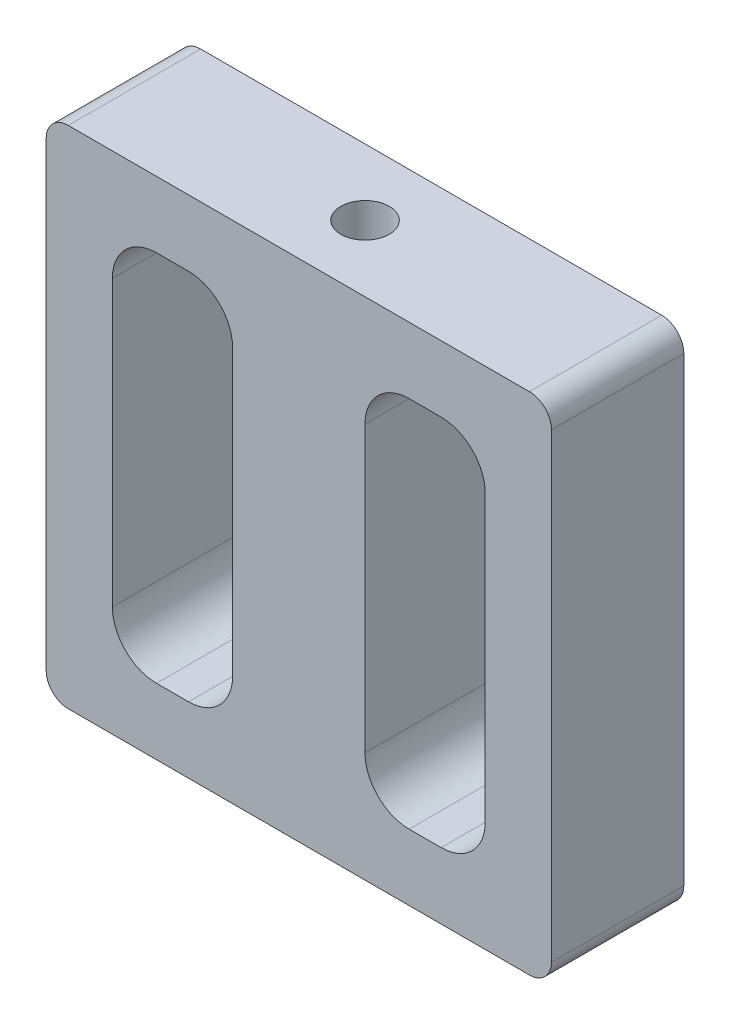
ISO-10303-21;
HEADER;
FILE_DESCRIPTION(('STEP AP214'),'2;1');
FILE_NAME('part.step','',(''),(''),'','','');
FILE_SCHEMA(('AUTOMOTIVE_DESIGN { 1 0 10303 214 1 1 1 1 }'));
ENDSEC;
DATA;
#1=APPLICATION_CONTEXT('core data for automotive mechanical design processes');
#2=APPLICATION_PROTOCOL_DEFINITION('international standard','automotive_design',2000,#1);
#3=PRODUCT_CONTEXT('',#1,'mechanical');
#4=PRODUCT('Part','Part','',(#3));
#5=PRODUCT_RELATED_PRODUCT_CATEGORY('part','',(#4));
#6=PRODUCT_DEFINITION_FORMATION('','',#4);
#7=PRODUCT_DEFINITION_CONTEXT('part definition',#1,'design');
#8=PRODUCT_DEFINITION('design','',#6,#7);
#9=PRODUCT_DEFINITION_SHAPE('','',#8);
#10=(LENGTH_UNIT() NAMED_UNIT(*) SI_UNIT(.MILLI.,.METRE.));
#11=(NAMED_UNIT(*) PLANE_ANGLE_UNIT() SI_UNIT($,.RADIAN.));
#12=(NAMED_UNIT(*) SI_UNIT($,.STERADIAN.) SOLID_ANGLE_UNIT());
#13=UNCERTAINTY_MEASURE_WITH_UNIT(LENGTH_MEASURE(1.E-05),#10,'distance_accuracy_value','');
#14=(GEOMETRIC_REPRESENTATION_CONTEXT(3) GLOBAL_UNCERTAINTY_ASSIGNED_CONTEXT((#13)) GLOBAL_UNIT_ASSIGNED_CONTEXT((#10,
#11,#12)) REPRESENTATION_CONTEXT('',''));
#15=CARTESIAN_POINT('',(0.,0.,0.));
#16=DIRECTION('',(0.,0.,1.));
#17=DIRECTION('',(1.,0.,0.));
#18=AXIS2_PLACEMENT_3D('',#15,#16,#17);
#19=CARTESIAN_POINT('',(-11.45,-11.45,6.));
#20=DIRECTION('',(1.,0.,0.));
#21=DIRECTION('',(0.,0.,-1.));
#22=AXIS2_PLACEMENT_3D('',#19,#20,#21);
#23=PLANE('',#22);
#24=DIRECTION('',(0.,-1.,0.));
#25=VECTOR('',#24,1.);
#26=CARTESIAN_POINT('',(-11.45,-11.45,6.));
#27=LINE('',#26,#25);
#28=CARTESIAN_POINT('',(-11.45,10.45,6.));
#29=VERTEX_POINT('',#28);
#30=CARTESIAN_POINT('',(-11.45,-10.45,6.));
#31=VERTEX_POINT('',#30);
#32=EDGE_CURVE('E242',#29,#31,#27,.T.);
#33=ORIENTED_EDGE('',*,*,#32,.F.);
#34=DIRECTION('',(0.,0.,-1.));
#35=VECTOR('',#34,1.);
#36=CARTESIAN_POINT('',(-11.45,10.45,6.));
#37=LINE('',#36,#35);
#38=CARTESIAN_POINT('',(-11.45,10.45,0.));
#39=VERTEX_POINT('',#38);
#40=EDGE_CURVE('E325',#29,#39,#37,.T.);
#41=ORIENTED_EDGE('',*,*,#40,.T.);
#42=DIRECTION('',(0.,-1.,0.));
#43=VECTOR('',#42,1.);
#44=CARTESIAN_POINT('',(-11.45,-11.45,0.));
#45=LINE('',#44,#43);
#46=CARTESIAN_POINT('',(-11.45,-10.45,0.));
#47=VERTEX_POINT('',#46);
#48=EDGE_CURVE('E237',#39,#47,#45,.T.);
#49=ORIENTED_EDGE('',*,*,#48,.T.);
#50=DIRECTION('',(0.,0.,-1.));
#51=VECTOR('',#50,1.);
#52=CARTESIAN_POINT('',(-11.45,-10.45,6.));
#53=LINE('',#52,#51);
#54=EDGE_CURVE('E323',#47,#31,#53,.F.);
#55=ORIENTED_EDGE('',*,*,#54,.T.);
#56=EDGE_LOOP('',(#33,#41,#49,#55));
#57=FACE_BOUND('',#56,.T.);
#58=ADVANCED_FACE('F34',(#57),#23,.F.);
#59=CARTESIAN_POINT('',(11.45,-11.45,6.));
#60=DIRECTION('',(0.,1.,0.));
#61=DIRECTION('',(-1.,0.,0.));
#62=AXIS2_PLACEMENT_3D('',#59,#60,#61);
#63=PLANE('',#62);
#64=CARTESIAN_POINT('',(0.,-11.45,3.));
#65=DIRECTION('',(0.,1.,0.));
#66=DIRECTION('',(-1.,0.,0.));
#67=AXIS2_PLACEMENT_3D('',#64,#65,#66);
#68=CIRCLE('',#67,1.1);
#69=CARTESIAN_POINT('',(-1.1,-11.45,3.));
#70=VERTEX_POINT('',#69);
#71=EDGE_CURVE('E234',#70,#70,#68,.T.);
#72=ORIENTED_EDGE('',*,*,#71,.T.);
#73=EDGE_LOOP('',(#72));
#74=FACE_BOUND('',#73,.T.);
#75=DIRECTION('',(1.,0.,0.));
#76=VECTOR('',#75,1.);
#77=CARTESIAN_POINT('',(11.45,-11.45,0.));
#78=LINE('',#77,#76);
#79=CARTESIAN_POINT('',(-10.45,-11.45,0.));
#80=VERTEX_POINT('',#79);
#81=CARTESIAN_POINT('',(10.45,-11.45,0.));
#82=VERTEX_POINT('',#81);
#83=EDGE_CURVE('E255',#80,#82,#78,.T.);
#84=ORIENTED_EDGE('',*,*,#83,.T.);
#85=DIRECTION('',(0.,0.,-1.));
#86=VECTOR('',#85,1.);
#87=CARTESIAN_POINT('',(10.45,-11.45,6.));
#88=LINE('',#87,#86);
#89=CARTESIAN_POINT('',(10.45,-11.45,6.));
#90=VERTEX_POINT('',#89);
#91=EDGE_CURVE('E11',#82,#90,#88,.F.);
#92=ORIENTED_EDGE('',*,*,#91,.T.);
#93=DIRECTION('',(1.,0.,0.));
#94=VECTOR('',#93,1.);
#95=CARTESIAN_POINT('',(11.45,-11.45,6.));
#96=LINE('',#95,#94);
#97=CARTESIAN_POINT('',(-10.45,-11.45,6.));
#98=VERTEX_POINT('',#97);
#99=EDGE_CURVE('E245',#98,#90,#96,.T.);
#100=ORIENTED_EDGE('',*,*,#99,.F.);
#101=DIRECTION('',(0.,0.,-1.));
#102=VECTOR('',#101,1.);
#103=CARTESIAN_POINT('',(-10.45,-11.45,6.));
#104=LINE('',#103,#102);
#105=EDGE_CURVE('E42',#98,#80,#104,.T.);
#106=ORIENTED_EDGE('',*,*,#105,.T.);
#107=EDGE_LOOP('',(#84,#92,#100,#106));
#108=FACE_BOUND('',#107,.T.);
#109=ADVANCED_FACE('F356',(#74,#108),#63,.F.);
#110=CARTESIAN_POINT('',(11.45,-11.45,6.));
#111=DIRECTION('',(-1.,0.,0.));
#112=DIRECTION('',(0.,0.,1.));
#113=AXIS2_PLACEMENT_3D('',#110,#111,#112);
#114=PLANE('',#113);
#115=DIRECTION('',(0.,1.,0.));
#116=VECTOR('',#115,1.);
#117=CARTESIAN_POINT('',(11.45,-11.45,0.));
#118=LINE('',#117,#116);
#119=CARTESIAN_POINT('',(11.45,-10.45,0.));
#120=VERTEX_POINT('',#119);
#121=CARTESIAN_POINT('',(11.45,10.45,0.));
#122=VERTEX_POINT('',#121);
#123=EDGE_CURVE('E258',#120,#122,#118,.T.);
#124=ORIENTED_EDGE('',*,*,#123,.T.);
#125=DIRECTION('',(0.,0.,-1.));
#126=VECTOR('',#125,1.);
#127=CARTESIAN_POINT('',(11.45,10.45,6.));
#128=LINE('',#127,#126);
#129=CARTESIAN_POINT('',(11.45,10.45,6.));
#130=VERTEX_POINT('',#129);
#131=EDGE_CURVE('E49',#122,#130,#128,.F.);
#132=ORIENTED_EDGE('',*,*,#131,.T.);
#133=DIRECTION('',(0.,1.,0.));
#134=VECTOR('',#133,1.);
#135=CARTESIAN_POINT('',(11.45,-11.45,6.));
#136=LINE('',#135,#134);
#137=CARTESIAN_POINT('',(11.45,-10.45,6.));
#138=VERTEX_POINT('',#137);
#139=EDGE_CURVE('E248',#138,#130,#136,.T.);
#140=ORIENTED_EDGE('',*,*,#139,.F.);
#141=DIRECTION('',(0.,0.,-1.));
#142=VECTOR('',#141,1.);
#143=CARTESIAN_POINT('',(11.45,-10.45,6.));
#144=LINE('',#143,#142);
#145=EDGE_CURVE('E348',#138,#120,#144,.T.);
#146=ORIENTED_EDGE('',*,*,#145,.T.);
#147=EDGE_LOOP('',(#124,#132,#140,#146));
#148=FACE_BOUND('',#147,.T.);
#149=ADVANCED_FACE('F365',(#148),#114,.F.);
#150=CARTESIAN_POINT('',(11.45,11.45,6.));
#151=DIRECTION('',(0.,-1.,0.));
#152=DIRECTION('',(1.,0.,0.));
#153=AXIS2_PLACEMENT_3D('',#150,#151,#152);
#154=PLANE('',#153);
#155=CARTESIAN_POINT('',(0.,11.45,3.));
#156=DIRECTION('',(0.,1.,0.));
#157=DIRECTION('',(-1.,0.,0.));
#158=AXIS2_PLACEMENT_3D('',#155,#156,#157);
#159=CIRCLE('',#158,1.1);
#160=CARTESIAN_POINT('',(-1.1,11.45,3.));
#161=VERTEX_POINT('',#160);
#162=EDGE_CURVE('E238',#161,#161,#159,.T.);
#163=ORIENTED_EDGE('',*,*,#162,.F.);
#164=EDGE_LOOP('',(#163));
#165=FACE_BOUND('',#164,.T.);
#166=DIRECTION('',(-1.,0.,0.));
#167=VECTOR('',#166,1.);
#168=CARTESIAN_POINT('',(11.45,11.45,0.));
#169=LINE('',#168,#167);
#170=CARTESIAN_POINT('',(10.45,11.45,0.));
#171=VERTEX_POINT('',#170);
#172=CARTESIAN_POINT('',(-10.45,11.45,0.));
#173=VERTEX_POINT('',#172);
#174=EDGE_CURVE('E246',#171,#173,#169,.T.);
#175=ORIENTED_EDGE('',*,*,#174,.T.);
#176=DIRECTION('',(0.,0.,-1.));
#177=VECTOR('',#176,1.);
#178=CARTESIAN_POINT('',(-10.45,11.45,6.));
#179=LINE('',#178,#177);
#180=CARTESIAN_POINT('',(-10.45,11.45,6.));
#181=VERTEX_POINT('',#180);
#182=EDGE_CURVE('E339',#173,#181,#179,.F.);
#183=ORIENTED_EDGE('',*,*,#182,.T.);
#184=DIRECTION('',(-1.,0.,0.));
#185=VECTOR('',#184,1.);
#186=CARTESIAN_POINT('',(11.45,11.45,6.));
#187=LINE('',#186,#185);
#188=CARTESIAN_POINT('',(10.45,11.45,6.));
#189=VERTEX_POINT('',#188);
#190=EDGE_CURVE('E250',#189,#181,#187,.T.);
#191=ORIENTED_EDGE('',*,*,#190,.F.);
#192=DIRECTION('',(0.,0.,-1.));
#193=VECTOR('',#192,1.);
#194=CARTESIAN_POINT('',(10.45,11.45,6.));
#195=LINE('',#194,#193);
#196=EDGE_CURVE('E336',#189,#171,#195,.T.);
#197=ORIENTED_EDGE('',*,*,#196,.T.);
#198=EDGE_LOOP('',(#175,#183,#191,#197));
#199=FACE_BOUND('',#198,.T.);
#200=ADVANCED_FACE('F374',(#165,#199),#154,.F.);
#201=CARTESIAN_POINT('',(0.,0.,6.));
#202=DIRECTION('',(0.,0.,1.));
#203=DIRECTION('',(1.,0.,0.));
#204=AXIS2_PLACEMENT_3D('',#201,#202,#203);
#205=PLANE('',#204);
#206=DIRECTION('',(-1.,0.,0.));
#207=VECTOR('',#206,1.);
#208=CARTESIAN_POINT('',(-3.,-8.45,6.));
#209=LINE('',#208,#207);
#210=CARTESIAN_POINT('',(-5.,-8.45,6.));
#211=VERTEX_POINT('',#210);
#212=CARTESIAN_POINT('',(-6.45,-8.45,6.));
#213=VERTEX_POINT('',#212);
#214=EDGE_CURVE('E241',#211,#213,#209,.T.);
#215=ORIENTED_EDGE('',*,*,#214,.T.);
#216=CARTESIAN_POINT('',(-6.45,-6.45,6.));
#217=DIRECTION('',(0.,0.,1.));
#218=DIRECTION('',(1.,0.,0.));
#219=AXIS2_PLACEMENT_3D('',#216,#217,#218);
#220=CIRCLE('',#219,2.);
#221=CARTESIAN_POINT('',(-8.45,-6.45,6.));
#222=VERTEX_POINT('',#221);
#223=EDGE_CURVE('E321',#213,#222,#220,.F.);
#224=ORIENTED_EDGE('',*,*,#223,.T.);
#225=DIRECTION('',(0.,1.,0.));
#226=VECTOR('',#225,1.);
#227=CARTESIAN_POINT('',(-8.45,8.45,6.));
#228=LINE('',#227,#226);
#229=CARTESIAN_POINT('',(-8.45,6.45,6.));
#230=VERTEX_POINT('',#229);
#231=EDGE_CURVE('E661',#222,#230,#228,.T.);
#232=ORIENTED_EDGE('',*,*,#231,.T.);
#233=CARTESIAN_POINT('',(-6.45,6.45,6.));
#234=DIRECTION('',(0.,0.,1.));
#235=DIRECTION('',(1.,0.,0.));
#236=AXIS2_PLACEMENT_3D('',#233,#234,#235);
#237=CIRCLE('',#236,2.);
#238=CARTESIAN_POINT('',(-6.44999999999999,8.45,6.));
#239=VERTEX_POINT('',#238);
#240=EDGE_CURVE('E313',#230,#239,#237,.F.);
#241=ORIENTED_EDGE('',*,*,#240,.T.);
#242=DIRECTION('',(1.,0.,0.));
#243=VECTOR('',#242,1.);
#244=CARTESIAN_POINT('',(-3.,8.45,6.));
#245=LINE('',#244,#243);
#246=CARTESIAN_POINT('',(-5.,8.45,6.));
#247=VERTEX_POINT('',#246);
#248=EDGE_CURVE('E674',#239,#247,#245,.T.);
#249=ORIENTED_EDGE('',*,*,#248,.T.);
#250=CARTESIAN_POINT('',(-5.,6.45,6.));
#251=DIRECTION('',(0.,0.,1.));
#252=DIRECTION('',(1.,0.,0.));
#253=AXIS2_PLACEMENT_3D('',#250,#251,#252);
#254=CIRCLE('',#253,2.);
#255=CARTESIAN_POINT('',(-3.,6.45,6.));
#256=VERTEX_POINT('',#255);
#257=EDGE_CURVE('E309',#247,#256,#254,.F.);
#258=ORIENTED_EDGE('',*,*,#257,.T.);
#259=DIRECTION('',(0.,-1.,0.));
#260=VECTOR('',#259,1.);
#261=CARTESIAN_POINT('',(-3.,8.45,6.));
#262=LINE('',#261,#260);
#263=CARTESIAN_POINT('',(-3.,-6.45,6.));
#264=VERTEX_POINT('',#263);
#265=EDGE_CURVE('E671',#256,#264,#262,.T.);
#266=ORIENTED_EDGE('',*,*,#265,.T.);
#267=CARTESIAN_POINT('',(-5.,-6.45,6.));
#268=DIRECTION('',(0.,0.,1.));
#269=DIRECTION('',(1.,0.,0.));
#270=AXIS2_PLACEMENT_3D('',#267,#268,#269);
#271=CIRCLE('',#270,2.);
#272=EDGE_CURVE('E317',#264,#211,#271,.F.);
#273=ORIENTED_EDGE('',*,*,#272,.T.);
#274=EDGE_LOOP('',(#215,#224,#232,#241,#249,#258,#266,#273));
#275=FACE_BOUND('',#274,.T.);
#276=DIRECTION('',(-1.,0.,0.));
#277=VECTOR('',#276,1.);
#278=CARTESIAN_POINT('',(3.,-8.45,6.));
#279=LINE('',#278,#277);
#280=CARTESIAN_POINT('',(6.45,-8.45,6.));
#281=VERTEX_POINT('',#280);
#282=CARTESIAN_POINT('',(5.,-8.45,6.));
#283=VERTEX_POINT('',#282);
#284=EDGE_CURVE('E639',#281,#283,#279,.T.);
#285=ORIENTED_EDGE('',*,*,#284,.T.);
#286=CARTESIAN_POINT('',(5.,-6.45,6.));
#287=DIRECTION('',(0.,0.,1.));
#288=DIRECTION('',(1.,0.,0.));
#289=AXIS2_PLACEMENT_3D('',#286,#287,#288);
#290=CIRCLE('',#289,2.);
#291=CARTESIAN_POINT('',(3.,-6.45,6.));
#292=VERTEX_POINT('',#291);
#293=EDGE_CURVE('E301',#283,#292,#290,.F.);
#294=ORIENTED_EDGE('',*,*,#293,.T.);
#295=DIRECTION('',(0.,1.,0.));
#296=VECTOR('',#295,1.);
#297=CARTESIAN_POINT('',(3.,8.45,6.));
#298=LINE('',#297,#296);
#299=CARTESIAN_POINT('',(3.,6.45,6.));
#300=VERTEX_POINT('',#299);
#301=EDGE_CURVE('E228',#292,#300,#298,.T.);
#302=ORIENTED_EDGE('',*,*,#301,.T.);
#303=CARTESIAN_POINT('',(5.,6.45,6.));
#304=DIRECTION('',(0.,0.,1.));
#305=DIRECTION('',(1.,0.,0.));
#306=AXIS2_PLACEMENT_3D('',#303,#304,#305);
#307=CIRCLE('',#306,2.);
#308=CARTESIAN_POINT('',(5.,8.45,6.));
#309=VERTEX_POINT('',#308);
#310=EDGE_CURVE('E305',#300,#309,#307,.F.);
#311=ORIENTED_EDGE('',*,*,#310,.T.);
#312=DIRECTION('',(1.,0.,0.));
#313=VECTOR('',#312,1.);
#314=CARTESIAN_POINT('',(3.,8.45,6.));
#315=LINE('',#314,#313);
#316=CARTESIAN_POINT('',(6.45,8.45,6.));
#317=VERTEX_POINT('',#316);
#318=EDGE_CURVE('E654',#309,#317,#315,.T.);
#319=ORIENTED_EDGE('',*,*,#318,.T.);
#320=CARTESIAN_POINT('',(6.45,6.45,6.));
#321=DIRECTION('',(0.,0.,1.));
#322=DIRECTION('',(1.,0.,0.));
#323=AXIS2_PLACEMENT_3D('',#320,#321,#322);
#324=CIRCLE('',#323,2.);
#325=CARTESIAN_POINT('',(8.45,6.45,6.));
#326=VERTEX_POINT('',#325);
#327=EDGE_CURVE('E206',#317,#326,#324,.F.);
#328=ORIENTED_EDGE('',*,*,#327,.T.);
#329=DIRECTION('',(0.,-1.,0.));
#330=VECTOR('',#329,1.);
#331=CARTESIAN_POINT('',(8.45,8.45,6.));
#332=LINE('',#331,#330);
#333=CARTESIAN_POINT('',(8.45,-6.45,6.));
#334=VERTEX_POINT('',#333);
#335=EDGE_CURVE('E216',#326,#334,#332,.T.);
#336=ORIENTED_EDGE('',*,*,#335,.T.);
#337=CARTESIAN_POINT('',(6.45,-6.45,6.));
#338=DIRECTION('',(0.,0.,1.));
#339=DIRECTION('',(1.,0.,0.));
#340=AXIS2_PLACEMENT_3D('',#337,#338,#339);
#341=CIRCLE('',#340,2.);
#342=EDGE_CURVE('E297',#334,#281,#341,.F.);
#343=ORIENTED_EDGE('',*,*,#342,.T.);
#344=EDGE_LOOP('',(#285,#294,#302,#311,#319,#328,#336,#343));
#345=FACE_BOUND('',#344,.T.);
#346=ORIENTED_EDGE('',*,*,#190,.T.);
#347=CARTESIAN_POINT('',(-10.45,10.45,6.));
#348=DIRECTION('',(0.,0.,1.));
#349=DIRECTION('',(1.,0.,0.));
#350=AXIS2_PLACEMENT_3D('',#347,#348,#349);
#351=CIRCLE('',#350,1.);
#352=EDGE_CURVE('E346',#181,#29,#351,.T.);
#353=ORIENTED_EDGE('',*,*,#352,.T.);
#354=ORIENTED_EDGE('',*,*,#32,.T.);
#355=CARTESIAN_POINT('',(-10.45,-10.45,6.));
#356=DIRECTION('',(0.,0.,1.));
#357=DIRECTION('',(1.,0.,0.));
#358=AXIS2_PLACEMENT_3D('',#355,#356,#357);
#359=CIRCLE('',#358,1.);
#360=EDGE_CURVE('E341',#31,#98,#359,.T.);
#361=ORIENTED_EDGE('',*,*,#360,.T.);
#362=ORIENTED_EDGE('',*,*,#99,.T.);
#363=CARTESIAN_POINT('',(10.45,-10.45,6.));
#364=DIRECTION('',(0.,0.,1.));
#365=DIRECTION('',(1.,0.,0.));
#366=AXIS2_PLACEMENT_3D('',#363,#364,#365);
#367=CIRCLE('',#366,1.);
#368=EDGE_CURVE('E56',#90,#138,#367,.T.);
#369=ORIENTED_EDGE('',*,*,#368,.T.);
#370=ORIENTED_EDGE('',*,*,#139,.T.);
#371=CARTESIAN_POINT('',(10.45,10.45,6.));
#372=DIRECTION('',(0.,0.,1.));
#373=DIRECTION('',(1.,0.,0.));
#374=AXIS2_PLACEMENT_3D('',#371,#372,#373);
#375=CIRCLE('',#374,1.);
#376=EDGE_CURVE('E344',#130,#189,#375,.T.);
#377=ORIENTED_EDGE('',*,*,#376,.T.);
#378=EDGE_LOOP('',(#346,#353,#354,#361,#362,#369,#370,#377));
#379=FACE_BOUND('',#378,.T.);
#380=ADVANCED_FACE('F367',(#275,#345,#379),#205,.T.);
#381=CARTESIAN_POINT('',(0.,0.,0.));
#382=DIRECTION('',(0.,0.,1.));
#383=DIRECTION('',(1.,0.,0.));
#384=AXIS2_PLACEMENT_3D('',#381,#382,#383);
#385=PLANE('',#384);
#386=DIRECTION('',(1.,0.,0.));
#387=VECTOR('',#386,1.);
#388=CARTESIAN_POINT('',(-3.,8.45,0.));
#389=LINE('',#388,#387);
#390=CARTESIAN_POINT('',(-6.44999999999999,8.45,0.));
#391=VERTEX_POINT('',#390);
#392=CARTESIAN_POINT('',(-5.,8.45,0.));
#393=VERTEX_POINT('',#392);
#394=EDGE_CURVE('E665',#391,#393,#389,.T.);
#395=ORIENTED_EDGE('',*,*,#394,.F.);
#396=CARTESIAN_POINT('',(-6.45,6.45,0.));
#397=DIRECTION('',(0.,0.,1.));
#398=DIRECTION('',(1.,0.,0.));
#399=AXIS2_PLACEMENT_3D('',#396,#397,#398);
#400=CIRCLE('',#399,2.);
#401=CARTESIAN_POINT('',(-8.45,6.45,0.));
#402=VERTEX_POINT('',#401);
#403=EDGE_CURVE('E311',#391,#402,#400,.T.);
#404=ORIENTED_EDGE('',*,*,#403,.T.);
#405=DIRECTION('',(0.,1.,0.));
#406=VECTOR('',#405,1.);
#407=CARTESIAN_POINT('',(-8.45,8.45,0.));
#408=LINE('',#407,#406);
#409=CARTESIAN_POINT('',(-8.45,-6.45,0.));
#410=VERTEX_POINT('',#409);
#411=EDGE_CURVE('E645',#410,#402,#408,.T.);
#412=ORIENTED_EDGE('',*,*,#411,.F.);
#413=CARTESIAN_POINT('',(-6.45,-6.45,0.));
#414=DIRECTION('',(0.,0.,1.));
#415=DIRECTION('',(1.,0.,0.));
#416=AXIS2_PLACEMENT_3D('',#413,#414,#415);
#417=CIRCLE('',#416,2.);
#418=CARTESIAN_POINT('',(-6.45,-8.45,0.));
#419=VERTEX_POINT('',#418);
#420=EDGE_CURVE('E319',#410,#419,#417,.T.);
#421=ORIENTED_EDGE('',*,*,#420,.T.);
#422=DIRECTION('',(-1.,0.,0.));
#423=VECTOR('',#422,1.);
#424=CARTESIAN_POINT('',(-3.,-8.45,0.));
#425=LINE('',#424,#423);
#426=CARTESIAN_POINT('',(-5.,-8.45,0.));
#427=VERTEX_POINT('',#426);
#428=EDGE_CURVE('E658',#427,#419,#425,.T.);
#429=ORIENTED_EDGE('',*,*,#428,.F.);
#430=CARTESIAN_POINT('',(-5.,-6.45,0.));
#431=DIRECTION('',(0.,0.,1.));
#432=DIRECTION('',(1.,0.,0.));
#433=AXIS2_PLACEMENT_3D('',#430,#431,#432);
#434=CIRCLE('',#433,2.);
#435=CARTESIAN_POINT('',(-3.,-6.45,0.));
#436=VERTEX_POINT('',#435);
#437=EDGE_CURVE('E315',#427,#436,#434,.T.);
#438=ORIENTED_EDGE('',*,*,#437,.T.);
#439=DIRECTION('',(0.,-1.,0.));
#440=VECTOR('',#439,1.);
#441=CARTESIAN_POINT('',(-3.,8.45,0.));
#442=LINE('',#441,#440);
#443=CARTESIAN_POINT('',(-3.,6.45,0.));
#444=VERTEX_POINT('',#443);
#445=EDGE_CURVE('E662',#444,#436,#442,.T.);
#446=ORIENTED_EDGE('',*,*,#445,.F.);
#447=CARTESIAN_POINT('',(-5.,6.45,0.));
#448=DIRECTION('',(0.,0.,1.));
#449=DIRECTION('',(1.,0.,0.));
#450=AXIS2_PLACEMENT_3D('',#447,#448,#449);
#451=CIRCLE('',#450,2.);
#452=EDGE_CURVE('E307',#444,#393,#451,.T.);
#453=ORIENTED_EDGE('',*,*,#452,.T.);
#454=EDGE_LOOP('',(#395,#404,#412,#421,#429,#438,#446,#453));
#455=FACE_BOUND('',#454,.T.);
#456=DIRECTION('',(1.,0.,0.));
#457=VECTOR('',#456,1.);
#458=CARTESIAN_POINT('',(3.,8.45,0.));
#459=LINE('',#458,#457);
#460=CARTESIAN_POINT('',(5.,8.45,0.));
#461=VERTEX_POINT('',#460);
#462=CARTESIAN_POINT('',(6.45,8.45,0.));
#463=VERTEX_POINT('',#462);
#464=EDGE_CURVE('E225',#461,#463,#459,.T.);
#465=ORIENTED_EDGE('',*,*,#464,.F.);
#466=CARTESIAN_POINT('',(5.,6.45,0.));
#467=DIRECTION('',(0.,0.,1.));
#468=DIRECTION('',(1.,0.,0.));
#469=AXIS2_PLACEMENT_3D('',#466,#467,#468);
#470=CIRCLE('',#469,2.);
#471=CARTESIAN_POINT('',(3.,6.45,0.));
#472=VERTEX_POINT('',#471);
#473=EDGE_CURVE('E303',#461,#472,#470,.T.);
#474=ORIENTED_EDGE('',*,*,#473,.T.);
#475=DIRECTION('',(0.,1.,0.));
#476=VECTOR('',#475,1.);
#477=CARTESIAN_POINT('',(3.,8.45,0.));
#478=LINE('',#477,#476);
#479=CARTESIAN_POINT('',(3.,-6.45,0.));
#480=VERTEX_POINT('',#479);
#481=EDGE_CURVE('E230',#480,#472,#478,.T.);
#482=ORIENTED_EDGE('',*,*,#481,.F.);
#483=CARTESIAN_POINT('',(5.,-6.45,0.));
#484=DIRECTION('',(0.,0.,1.));
#485=DIRECTION('',(1.,0.,0.));
#486=AXIS2_PLACEMENT_3D('',#483,#484,#485);
#487=CIRCLE('',#486,2.);
#488=CARTESIAN_POINT('',(5.,-8.45,0.));
#489=VERTEX_POINT('',#488);
#490=EDGE_CURVE('E299',#480,#489,#487,.T.);
#491=ORIENTED_EDGE('',*,*,#490,.T.);
#492=DIRECTION('',(-1.,0.,0.));
#493=VECTOR('',#492,1.);
#494=CARTESIAN_POINT('',(3.,-8.45,0.));
#495=LINE('',#494,#493);
#496=CARTESIAN_POINT('',(6.45,-8.45,0.));
#497=VERTEX_POINT('',#496);
#498=EDGE_CURVE('E224',#497,#489,#495,.T.);
#499=ORIENTED_EDGE('',*,*,#498,.F.);
#500=CARTESIAN_POINT('',(6.45,-6.45,0.));
#501=DIRECTION('',(0.,0.,1.));
#502=DIRECTION('',(1.,0.,0.));
#503=AXIS2_PLACEMENT_3D('',#500,#501,#502);
#504=CIRCLE('',#503,2.);
#505=CARTESIAN_POINT('',(8.45,-6.45,0.));
#506=VERTEX_POINT('',#505);
#507=EDGE_CURVE('E223',#497,#506,#504,.T.);
#508=ORIENTED_EDGE('',*,*,#507,.T.);
#509=DIRECTION('',(0.,-1.,0.));
#510=VECTOR('',#509,1.);
#511=CARTESIAN_POINT('',(8.45,8.45,0.));
#512=LINE('',#511,#510);
#513=CARTESIAN_POINT('',(8.45,6.45,0.));
#514=VERTEX_POINT('',#513);
#515=EDGE_CURVE('E213',#514,#506,#512,.T.);
#516=ORIENTED_EDGE('',*,*,#515,.F.);
#517=CARTESIAN_POINT('',(6.45,6.45,0.));
#518=DIRECTION('',(0.,0.,1.));
#519=DIRECTION('',(1.,0.,0.));
#520=AXIS2_PLACEMENT_3D('',#517,#518,#519);
#521=CIRCLE('',#520,2.);
#522=EDGE_CURVE('E196',#514,#463,#521,.T.);
#523=ORIENTED_EDGE('',*,*,#522,.T.);
#524=EDGE_LOOP('',(#465,#474,#482,#491,#499,#508,#516,#523));
#525=FACE_BOUND('',#524,.T.);
#526=ORIENTED_EDGE('',*,*,#48,.F.);
#527=CARTESIAN_POINT('',(-10.45,10.45,0.));
#528=DIRECTION('',(0.,0.,1.));
#529=DIRECTION('',(1.,0.,0.));
#530=AXIS2_PLACEMENT_3D('',#527,#528,#529);
#531=CIRCLE('',#530,1.);
#532=EDGE_CURVE('E334',#39,#173,#531,.F.);
#533=ORIENTED_EDGE('',*,*,#532,.T.);
#534=ORIENTED_EDGE('',*,*,#174,.F.);
#535=CARTESIAN_POINT('',(10.45,10.45,0.));
#536=DIRECTION('',(0.,0.,1.));
#537=DIRECTION('',(1.,0.,0.));
#538=AXIS2_PLACEMENT_3D('',#535,#536,#537);
#539=CIRCLE('',#538,1.);
#540=EDGE_CURVE('E332',#171,#122,#539,.F.);
#541=ORIENTED_EDGE('',*,*,#540,.T.);
#542=ORIENTED_EDGE('',*,*,#123,.F.);
#543=CARTESIAN_POINT('',(10.45,-10.45,0.));
#544=DIRECTION('',(0.,0.,1.));
#545=DIRECTION('',(1.,0.,0.));
#546=AXIS2_PLACEMENT_3D('',#543,#544,#545);
#547=CIRCLE('',#546,1.);
#548=EDGE_CURVE('E330',#120,#82,#547,.F.);
#549=ORIENTED_EDGE('',*,*,#548,.T.);
#550=ORIENTED_EDGE('',*,*,#83,.F.);
#551=CARTESIAN_POINT('',(-10.45,-10.45,0.));
#552=DIRECTION('',(0.,0.,1.));
#553=DIRECTION('',(1.,0.,0.));
#554=AXIS2_PLACEMENT_3D('',#551,#552,#553);
#555=CIRCLE('',#554,1.);
#556=EDGE_CURVE('E328',#80,#47,#555,.F.);
#557=ORIENTED_EDGE('',*,*,#556,.T.);
#558=EDGE_LOOP('',(#526,#533,#534,#541,#542,#549,#550,#557));
#559=FACE_BOUND('',#558,.T.);
#560=ADVANCED_FACE('F220',(#455,#525,#559),#385,.F.);
#561=CARTESIAN_POINT('',(0.,-11.45,3.));
#562=DIRECTION('',(0.,1.,0.));
#563=DIRECTION('',(-1.,0.,0.));
#564=AXIS2_PLACEMENT_3D('',#561,#562,#563);
#565=CYLINDRICAL_SURFACE('',#564,1.1);
#566=ORIENTED_EDGE('',*,*,#71,.F.);
#567=EDGE_LOOP('',(#566));
#568=FACE_BOUND('',#567,.T.);
#569=ORIENTED_EDGE('',*,*,#162,.T.);
#570=EDGE_LOOP('',(#569));
#571=FACE_BOUND('',#570,.T.);
#572=ADVANCED_FACE('F560',(#568,#571),#565,.F.);
#573=CARTESIAN_POINT('',(3.,8.45,6.));
#574=DIRECTION('',(-1.,0.,0.));
#575=DIRECTION('',(0.,-1.,0.));
#576=AXIS2_PLACEMENT_3D('',#573,#574,#575);
#577=PLANE('',#576);
#578=ORIENTED_EDGE('',*,*,#301,.F.);
#579=DIRECTION('',(0.,0.,-1.));
#580=VECTOR('',#579,1.);
#581=CARTESIAN_POINT('',(3.,-6.45,0.));
#582=LINE('',#581,#580);
#583=EDGE_CURVE('E273',#292,#480,#582,.T.);
#584=ORIENTED_EDGE('',*,*,#583,.T.);
#585=ORIENTED_EDGE('',*,*,#481,.T.);
#586=DIRECTION('',(0.,0.,-1.));
#587=VECTOR('',#586,1.);
#588=CARTESIAN_POINT('',(3.,6.45,6.));
#589=LINE('',#588,#587);
#590=EDGE_CURVE('E271',#472,#300,#589,.F.);
#591=ORIENTED_EDGE('',*,*,#590,.T.);
#592=EDGE_LOOP('',(#578,#584,#585,#591));
#593=FACE_BOUND('',#592,.T.);
#594=ADVANCED_FACE('F551',(#593),#577,.F.);
#595=CARTESIAN_POINT('',(3.,-8.45,6.));
#596=DIRECTION('',(0.,-1.,0.));
#597=DIRECTION('',(0.,0.,-1.));
#598=AXIS2_PLACEMENT_3D('',#595,#596,#597);
#599=PLANE('',#598);
#600=ORIENTED_EDGE('',*,*,#284,.F.);
#601=DIRECTION('',(0.,0.,-1.));
#602=VECTOR('',#601,1.);
#603=CARTESIAN_POINT('',(6.45,-8.45,0.));
#604=LINE('',#603,#602);
#605=EDGE_CURVE('E268',#281,#497,#604,.T.);
#606=ORIENTED_EDGE('',*,*,#605,.T.);
#607=ORIENTED_EDGE('',*,*,#498,.T.);
#608=DIRECTION('',(0.,0.,-1.));
#609=VECTOR('',#608,1.);
#610=CARTESIAN_POINT('',(5.,-8.45,6.));
#611=LINE('',#610,#609);
#612=EDGE_CURVE('E266',#489,#283,#611,.F.);
#613=ORIENTED_EDGE('',*,*,#612,.T.);
#614=EDGE_LOOP('',(#600,#606,#607,#613));
#615=FACE_BOUND('',#614,.T.);
#616=ADVANCED_FACE('F543',(#615),#599,.F.);
#617=CARTESIAN_POINT('',(8.45,8.45,6.));
#618=DIRECTION('',(1.,0.,0.));
#619=DIRECTION('',(0.,1.,0.));
#620=AXIS2_PLACEMENT_3D('',#617,#618,#619);
#621=PLANE('',#620);
#622=ORIENTED_EDGE('',*,*,#335,.F.);
#623=DIRECTION('',(0.,0.,-1.));
#624=VECTOR('',#623,1.);
#625=CARTESIAN_POINT('',(8.45,6.45,0.));
#626=LINE('',#625,#624);
#627=EDGE_CURVE('E200',#326,#514,#626,.T.);
#628=ORIENTED_EDGE('',*,*,#627,.T.);
#629=ORIENTED_EDGE('',*,*,#515,.T.);
#630=DIRECTION('',(0.,0.,-1.));
#631=VECTOR('',#630,1.);
#632=CARTESIAN_POINT('',(8.45,-6.45,6.));
#633=LINE('',#632,#631);
#634=EDGE_CURVE('E218',#506,#334,#633,.F.);
#635=ORIENTED_EDGE('',*,*,#634,.T.);
#636=EDGE_LOOP('',(#622,#628,#629,#635));
#637=FACE_BOUND('',#636,.T.);
#638=ADVANCED_FACE('F212',(#637),#621,.F.);
#639=CARTESIAN_POINT('',(3.,8.45,6.));
#640=DIRECTION('',(0.,1.,0.));
#641=DIRECTION('',(0.,0.,1.));
#642=AXIS2_PLACEMENT_3D('',#639,#640,#641);
#643=PLANE('',#642);
#644=ORIENTED_EDGE('',*,*,#464,.T.);
#645=DIRECTION('',(0.,0.,-1.));
#646=VECTOR('',#645,1.);
#647=CARTESIAN_POINT('',(6.45,8.45,6.));
#648=LINE('',#647,#646);
#649=EDGE_CURVE('E201',#463,#317,#648,.F.);
#650=ORIENTED_EDGE('',*,*,#649,.T.);
#651=ORIENTED_EDGE('',*,*,#318,.F.);
#652=DIRECTION('',(0.,0.,-1.));
#653=VECTOR('',#652,1.);
#654=CARTESIAN_POINT('',(5.,8.45,0.));
#655=LINE('',#654,#653);
#656=EDGE_CURVE('E217',#309,#461,#655,.T.);
#657=ORIENTED_EDGE('',*,*,#656,.T.);
#658=EDGE_LOOP('',(#644,#650,#651,#657));
#659=FACE_BOUND('',#658,.T.);
#660=ADVANCED_FACE('F526',(#659),#643,.F.);
#661=CARTESIAN_POINT('',(-8.45,8.45,6.));
#662=DIRECTION('',(-1.,0.,0.));
#663=DIRECTION('',(0.,-1.,0.));
#664=AXIS2_PLACEMENT_3D('',#661,#662,#663);
#665=PLANE('',#664);
#666=ORIENTED_EDGE('',*,*,#411,.T.);
#667=DIRECTION('',(0.,0.,-1.));
#668=VECTOR('',#667,1.);
#669=CARTESIAN_POINT('',(-8.45,6.45,6.));
#670=LINE('',#669,#668);
#671=EDGE_CURVE('E289',#402,#230,#670,.F.);
#672=ORIENTED_EDGE('',*,*,#671,.T.);
#673=ORIENTED_EDGE('',*,*,#231,.F.);
#674=DIRECTION('',(0.,0.,-1.));
#675=VECTOR('',#674,1.);
#676=CARTESIAN_POINT('',(-8.45,-6.45,0.));
#677=LINE('',#676,#675);
#678=EDGE_CURVE('E286',#222,#410,#677,.T.);
#679=ORIENTED_EDGE('',*,*,#678,.T.);
#680=EDGE_LOOP('',(#666,#672,#673,#679));
#681=FACE_BOUND('',#680,.T.);
#682=ADVANCED_FACE('F517',(#681),#665,.F.);
#683=CARTESIAN_POINT('',(-3.,-8.45,6.));
#684=DIRECTION('',(0.,-1.,0.));
#685=DIRECTION('',(1.,0.,0.));
#686=AXIS2_PLACEMENT_3D('',#683,#684,#685);
#687=PLANE('',#686);
#688=ORIENTED_EDGE('',*,*,#214,.F.);
#689=DIRECTION('',(0.,0.,-1.));
#690=VECTOR('',#689,1.);
#691=CARTESIAN_POINT('',(-5.,-8.45,0.));
#692=LINE('',#691,#690);
#693=EDGE_CURVE('E207',#211,#427,#692,.T.);
#694=ORIENTED_EDGE('',*,*,#693,.T.);
#695=ORIENTED_EDGE('',*,*,#428,.T.);
#696=DIRECTION('',(0.,0.,-1.));
#697=VECTOR('',#696,1.);
#698=CARTESIAN_POINT('',(-6.45,-8.45,6.));
#699=LINE('',#698,#697);
#700=EDGE_CURVE('E291',#419,#213,#699,.F.);
#701=ORIENTED_EDGE('',*,*,#700,.T.);
#702=EDGE_LOOP('',(#688,#694,#695,#701));
#703=FACE_BOUND('',#702,.T.);
#704=ADVANCED_FACE('F508',(#703),#687,.F.);
#705=CARTESIAN_POINT('',(-3.,8.45,6.));
#706=DIRECTION('',(1.,0.,0.));
#707=DIRECTION('',(0.,1.,0.));
#708=AXIS2_PLACEMENT_3D('',#705,#706,#707);
#709=PLANE('',#708);
#710=ORIENTED_EDGE('',*,*,#265,.F.);
#711=DIRECTION('',(0.,0.,-1.));
#712=VECTOR('',#711,1.);
#713=CARTESIAN_POINT('',(-3.,6.45,0.));
#714=LINE('',#713,#712);
#715=EDGE_CURVE('E278',#256,#444,#714,.T.);
#716=ORIENTED_EDGE('',*,*,#715,.T.);
#717=ORIENTED_EDGE('',*,*,#445,.T.);
#718=DIRECTION('',(0.,0.,-1.));
#719=VECTOR('',#718,1.);
#720=CARTESIAN_POINT('',(-3.,-6.45,6.));
#721=LINE('',#720,#719);
#722=EDGE_CURVE('E276',#436,#264,#721,.F.);
#723=ORIENTED_EDGE('',*,*,#722,.T.);
#724=EDGE_LOOP('',(#710,#716,#717,#723));
#725=FACE_BOUND('',#724,.T.);
#726=ADVANCED_FACE('F499',(#725),#709,.F.);
#727=CARTESIAN_POINT('',(-3.,8.45,6.));
#728=DIRECTION('',(0.,1.,0.));
#729=DIRECTION('',(-1.,0.,0.));
#730=AXIS2_PLACEMENT_3D('',#727,#728,#729);
#731=PLANE('',#730);
#732=ORIENTED_EDGE('',*,*,#394,.T.);
#733=DIRECTION('',(0.,0.,-1.));
#734=VECTOR('',#733,1.);
#735=CARTESIAN_POINT('',(-5.,8.45,6.));
#736=LINE('',#735,#734);
#737=EDGE_CURVE('E284',#393,#247,#736,.F.);
#738=ORIENTED_EDGE('',*,*,#737,.T.);
#739=ORIENTED_EDGE('',*,*,#248,.F.);
#740=DIRECTION('',(0.,0.,-1.));
#741=VECTOR('',#740,1.);
#742=CARTESIAN_POINT('',(-6.44999999999999,8.45,0.));
#743=LINE('',#742,#741);
#744=EDGE_CURVE('E281',#239,#391,#743,.T.);
#745=ORIENTED_EDGE('',*,*,#744,.T.);
#746=EDGE_LOOP('',(#732,#738,#739,#745));
#747=FACE_BOUND('',#746,.T.);
#748=ADVANCED_FACE('F399',(#747),#731,.F.);
#749=CARTESIAN_POINT('',(6.45,6.45,6.));
#750=DIRECTION('',(0.,0.,1.));
#751=DIRECTION('',(1.,0.,0.));
#752=AXIS2_PLACEMENT_3D('',#749,#750,#751);
#753=CYLINDRICAL_SURFACE('',#752,2.);
#754=ORIENTED_EDGE('',*,*,#327,.F.);
#755=ORIENTED_EDGE('',*,*,#649,.F.);
#756=ORIENTED_EDGE('',*,*,#522,.F.);
#757=ORIENTED_EDGE('',*,*,#627,.F.);
#758=EDGE_LOOP('',(#754,#755,#756,#757));
#759=FACE_BOUND('',#758,.T.);
#760=ADVANCED_FACE('F199',(#759),#753,.F.);
#761=CARTESIAN_POINT('',(6.45,-6.45,6.));
#762=DIRECTION('',(0.,0.,1.));
#763=DIRECTION('',(1.,0.,0.));
#764=AXIS2_PLACEMENT_3D('',#761,#762,#763);
#765=CYLINDRICAL_SURFACE('',#764,2.);
#766=ORIENTED_EDGE('',*,*,#342,.F.);
#767=ORIENTED_EDGE('',*,*,#634,.F.);
#768=ORIENTED_EDGE('',*,*,#507,.F.);
#769=ORIENTED_EDGE('',*,*,#605,.F.);
#770=EDGE_LOOP('',(#766,#767,#768,#769));
#771=FACE_BOUND('',#770,.T.);
#772=ADVANCED_FACE('F398',(#771),#765,.F.);
#773=CARTESIAN_POINT('',(5.,-6.45,6.));
#774=DIRECTION('',(0.,0.,1.));
#775=DIRECTION('',(1.,0.,0.));
#776=AXIS2_PLACEMENT_3D('',#773,#774,#775);
#777=CYLINDRICAL_SURFACE('',#776,2.);
#778=ORIENTED_EDGE('',*,*,#293,.F.);
#779=ORIENTED_EDGE('',*,*,#612,.F.);
#780=ORIENTED_EDGE('',*,*,#490,.F.);
#781=ORIENTED_EDGE('',*,*,#583,.F.);
#782=EDGE_LOOP('',(#778,#779,#780,#781));
#783=FACE_BOUND('',#782,.T.);
#784=ADVANCED_FACE('F402',(#783),#777,.F.);
#785=CARTESIAN_POINT('',(5.,6.45,6.));
#786=DIRECTION('',(0.,0.,1.));
#787=DIRECTION('',(1.,0.,0.));
#788=AXIS2_PLACEMENT_3D('',#785,#786,#787);
#789=CYLINDRICAL_SURFACE('',#788,2.);
#790=ORIENTED_EDGE('',*,*,#310,.F.);
#791=ORIENTED_EDGE('',*,*,#590,.F.);
#792=ORIENTED_EDGE('',*,*,#473,.F.);
#793=ORIENTED_EDGE('',*,*,#656,.F.);
#794=EDGE_LOOP('',(#790,#791,#792,#793));
#795=FACE_BOUND('',#794,.T.);
#796=ADVANCED_FACE('F406',(#795),#789,.F.);
#797=CARTESIAN_POINT('',(-5.,6.45,6.));
#798=DIRECTION('',(0.,0.,1.));
#799=DIRECTION('',(1.,0.,0.));
#800=AXIS2_PLACEMENT_3D('',#797,#798,#799);
#801=CYLINDRICAL_SURFACE('',#800,2.);
#802=ORIENTED_EDGE('',*,*,#257,.F.);
#803=ORIENTED_EDGE('',*,*,#737,.F.);
#804=ORIENTED_EDGE('',*,*,#452,.F.);
#805=ORIENTED_EDGE('',*,*,#715,.F.);
#806=EDGE_LOOP('',(#802,#803,#804,#805));
#807=FACE_BOUND('',#806,.T.);
#808=ADVANCED_FACE('F410',(#807),#801,.F.);
#809=CARTESIAN_POINT('',(-6.45,6.45,6.));
#810=DIRECTION('',(0.,0.,1.));
#811=DIRECTION('',(1.,0.,0.));
#812=AXIS2_PLACEMENT_3D('',#809,#810,#811);
#813=CYLINDRICAL_SURFACE('',#812,2.);
#814=ORIENTED_EDGE('',*,*,#240,.F.);
#815=ORIENTED_EDGE('',*,*,#671,.F.);
#816=ORIENTED_EDGE('',*,*,#403,.F.);
#817=ORIENTED_EDGE('',*,*,#744,.F.);
#818=EDGE_LOOP('',(#814,#815,#816,#817));
#819=FACE_BOUND('',#818,.T.);
#820=ADVANCED_FACE('F414',(#819),#813,.F.);
#821=CARTESIAN_POINT('',(-5.,-6.45,6.));
#822=DIRECTION('',(0.,0.,1.));
#823=DIRECTION('',(1.,0.,0.));
#824=AXIS2_PLACEMENT_3D('',#821,#822,#823);
#825=CYLINDRICAL_SURFACE('',#824,2.);
#826=ORIENTED_EDGE('',*,*,#272,.F.);
#827=ORIENTED_EDGE('',*,*,#722,.F.);
#828=ORIENTED_EDGE('',*,*,#437,.F.);
#829=ORIENTED_EDGE('',*,*,#693,.F.);
#830=EDGE_LOOP('',(#826,#827,#828,#829));
#831=FACE_BOUND('',#830,.T.);
#832=ADVANCED_FACE('F418',(#831),#825,.F.);
#833=CARTESIAN_POINT('',(-6.45,-6.45,6.));
#834=DIRECTION('',(0.,0.,1.));
#835=DIRECTION('',(1.,0.,0.));
#836=AXIS2_PLACEMENT_3D('',#833,#834,#835);
#837=CYLINDRICAL_SURFACE('',#836,2.);
#838=ORIENTED_EDGE('',*,*,#223,.F.);
#839=ORIENTED_EDGE('',*,*,#700,.F.);
#840=ORIENTED_EDGE('',*,*,#420,.F.);
#841=ORIENTED_EDGE('',*,*,#678,.F.);
#842=EDGE_LOOP('',(#838,#839,#840,#841));
#843=FACE_BOUND('',#842,.T.);
#844=ADVANCED_FACE('F422',(#843),#837,.F.);
#845=CARTESIAN_POINT('',(-10.45,10.45,6.));
#846=DIRECTION('',(0.,0.,-1.));
#847=DIRECTION('',(-1.,0.,0.));
#848=AXIS2_PLACEMENT_3D('',#845,#846,#847);
#849=CYLINDRICAL_SURFACE('',#848,1.);
#850=ORIENTED_EDGE('',*,*,#352,.F.);
#851=ORIENTED_EDGE('',*,*,#182,.F.);
#852=ORIENTED_EDGE('',*,*,#532,.F.);
#853=ORIENTED_EDGE('',*,*,#40,.F.);
#854=EDGE_LOOP('',(#850,#851,#852,#853));
#855=FACE_BOUND('',#854,.T.);
#856=ADVANCED_FACE('F379',(#855),#849,.T.);
#857=CARTESIAN_POINT('',(10.45,10.45,6.));
#858=DIRECTION('',(0.,0.,-1.));
#859=DIRECTION('',(-1.,0.,0.));
#860=AXIS2_PLACEMENT_3D('',#857,#858,#859);
#861=CYLINDRICAL_SURFACE('',#860,1.);
#862=ORIENTED_EDGE('',*,*,#376,.F.);
#863=ORIENTED_EDGE('',*,*,#131,.F.);
#864=ORIENTED_EDGE('',*,*,#540,.F.);
#865=ORIENTED_EDGE('',*,*,#196,.F.);
#866=EDGE_LOOP('',(#862,#863,#864,#865));
#867=FACE_BOUND('',#866,.T.);
#868=ADVANCED_FACE('F371',(#867),#861,.T.);
#869=CARTESIAN_POINT('',(10.45,-10.45,6.));
#870=DIRECTION('',(0.,0.,-1.));
#871=DIRECTION('',(-1.,0.,0.));
#872=AXIS2_PLACEMENT_3D('',#869,#870,#871);
#873=CYLINDRICAL_SURFACE('',#872,1.);
#874=ORIENTED_EDGE('',*,*,#368,.F.);
#875=ORIENTED_EDGE('',*,*,#91,.F.);
#876=ORIENTED_EDGE('',*,*,#548,.F.);
#877=ORIENTED_EDGE('',*,*,#145,.F.);
#878=EDGE_LOOP('',(#874,#875,#876,#877));
#879=FACE_BOUND('',#878,.T.);
#880=ADVANCED_FACE('F364',(#879),#873,.T.);
#881=CARTESIAN_POINT('',(-10.45,-10.45,6.));
#882=DIRECTION('',(0.,0.,-1.));
#883=DIRECTION('',(-1.,0.,0.));
#884=AXIS2_PLACEMENT_3D('',#881,#882,#883);
#885=CYLINDRICAL_SURFACE('',#884,1.);
#886=ORIENTED_EDGE('',*,*,#360,.F.);
#887=ORIENTED_EDGE('',*,*,#54,.F.);
#888=ORIENTED_EDGE('',*,*,#556,.F.);
#889=ORIENTED_EDGE('',*,*,#105,.F.);
#890=EDGE_LOOP('',(#886,#887,#888,#889));
#891=FACE_BOUND('',#890,.T.);
#892=ADVANCED_FACE('F36',(#891),#885,.T.);
#893=CLOSED_SHELL('',(#58,#109,#149,#200,#380,#560,#572,#594,#616,#638,#660,#682,#704,#726,#748,
#760,#772,#784,#796,#808,#820,#832,#844,#856,#868,#880,#892));
#894=MANIFOLD_SOLID_BREP('B2',#893);
#895=ADVANCED_BREP_SHAPE_REPRESENTATION('',(#18,#894),#14);
#896=SHAPE_DEFINITION_REPRESENTATION(#9,#895);
ENDSEC;
END-ISO-10303-21;
